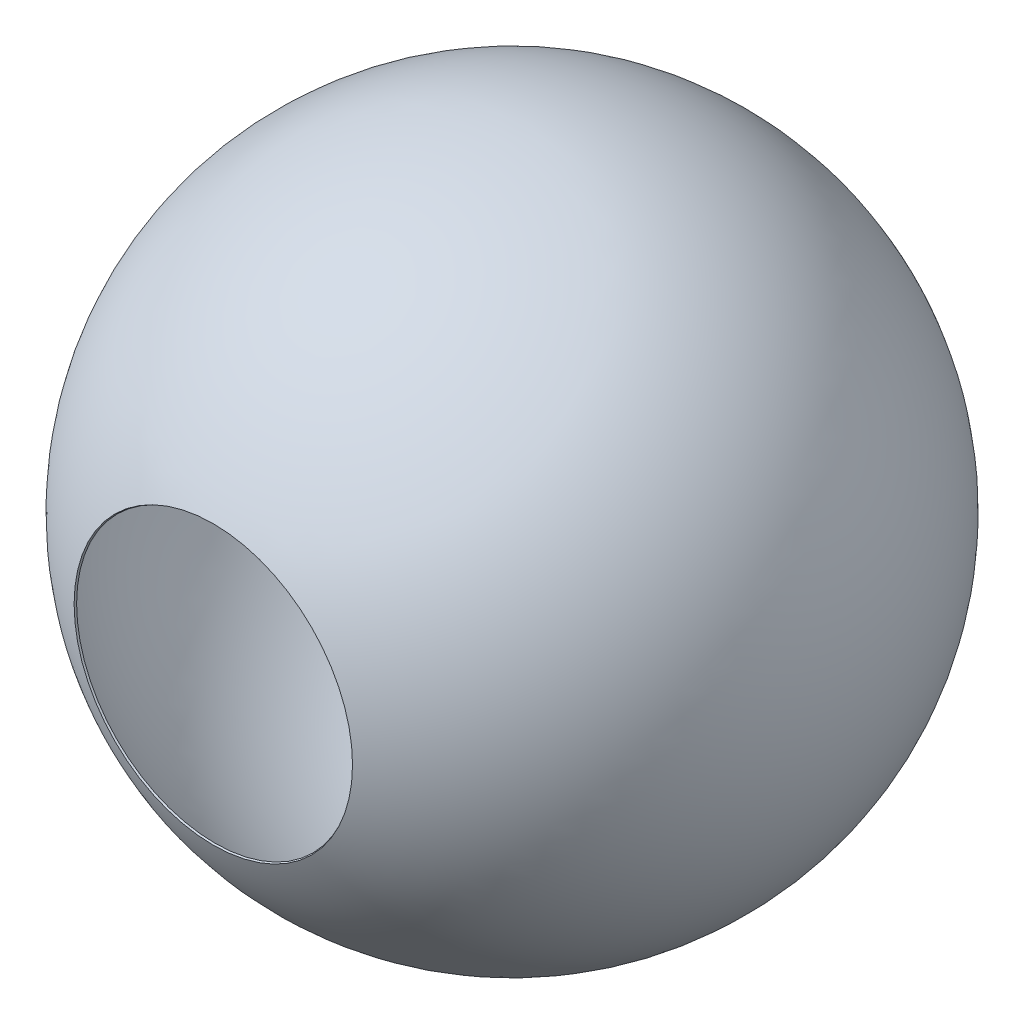
ISO-10303-21;
HEADER;
FILE_DESCRIPTION(('STEP AP214'),'2;1');
FILE_NAME('part.step','',(''),(''),'','','');
FILE_SCHEMA(('AUTOMOTIVE_DESIGN { 1 0 10303 214 1 1 1 1 }'));
ENDSEC;
DATA;
#1=APPLICATION_CONTEXT('core data for automotive mechanical design processes');
#2=APPLICATION_PROTOCOL_DEFINITION('international standard','automotive_design',2000,#1);
#3=PRODUCT_CONTEXT('',#1,'mechanical');
#4=PRODUCT('Part','Part','',(#3));
#5=PRODUCT_RELATED_PRODUCT_CATEGORY('part','',(#4));
#6=PRODUCT_DEFINITION_FORMATION('','',#4);
#7=PRODUCT_DEFINITION_CONTEXT('part definition',#1,'design');
#8=PRODUCT_DEFINITION('design','',#6,#7);
#9=PRODUCT_DEFINITION_SHAPE('','',#8);
#10=(LENGTH_UNIT() NAMED_UNIT(*) SI_UNIT(.MILLI.,.METRE.));
#11=(NAMED_UNIT(*) PLANE_ANGLE_UNIT() SI_UNIT($,.RADIAN.));
#12=(NAMED_UNIT(*) SI_UNIT($,.STERADIAN.) SOLID_ANGLE_UNIT());
#13=UNCERTAINTY_MEASURE_WITH_UNIT(LENGTH_MEASURE(1.E-05),#10,'distance_accuracy_value','');
#14=(GEOMETRIC_REPRESENTATION_CONTEXT(3) GLOBAL_UNCERTAINTY_ASSIGNED_CONTEXT((#13)) GLOBAL_UNIT_ASSIGNED_CONTEXT((#10,
#11,#12)) REPRESENTATION_CONTEXT('',''));
#15=CARTESIAN_POINT('',(0.,0.,0.));
#16=DIRECTION('',(0.,0.,1.));
#17=DIRECTION('',(1.,0.,0.));
#18=AXIS2_PLACEMENT_3D('',#15,#16,#17);
#19=CARTESIAN_POINT('',(0.,125.,-531.601551916471));
#20=DIRECTION('',(0.,0.,1.));
#21=DIRECTION('',(0.,-1.,0.));
#22=AXIS2_PLACEMENT_3D('',#19,#20,#21);
#23=PLANE('',#22);
#24=CARTESIAN_POINT('',(0.,2.4980018054066E-13,-531.601551916471));
#25=DIRECTION('',(0.,0.,1.));
#26=DIRECTION('',(0.,-1.,0.));
#27=AXIS2_PLACEMENT_3D('',#24,#25,#26);
#28=CIRCLE('',#27,125.);
#29=CARTESIAN_POINT('',(0.,125.,-531.601551916471));
#30=VERTEX_POINT('',#29);
#31=EDGE_CURVE('E10',#30,#30,#28,.T.);
#32=ORIENTED_EDGE('',*,*,#31,.F.);
#33=EDGE_LOOP('',(#32));
#34=FACE_BOUND('',#33,.T.);
#35=ADVANCED_FACE('F36',(#34),#23,.F.);
#36=CARTESIAN_POINT('',(0.,0.,0.));
#37=DIRECTION('',(0.,0.,1.));
#38=DIRECTION('',(0.,1.,0.));
#39=AXIS2_PLACEMENT_3D('',#36,#37,#38);
#40=SPHERICAL_SURFACE('',#39,546.1);
#41=CARTESIAN_POINT('',(0.,0.,495.));
#42=DIRECTION('',(0.,0.,1.));
#43=DIRECTION('',(0.,-1.,0.));
#44=AXIS2_PLACEMENT_3D('',#41,#42,#43);
#45=CIRCLE('',#44,230.651707125701);
#46=CARTESIAN_POINT('',(0.,230.6517071257,495.));
#47=VERTEX_POINT('',#46);
#48=EDGE_CURVE('E42',#47,#47,#45,.T.);
#49=CARTESIAN_POINT('',(0.,230.6517071257,495.));
#50=CARTESIAN_POINT('',(0.,233.841623475158,493.513621901903));
#51=CARTESIAN_POINT('',(0.,237.017167923415,491.996400730098));
#52=CARTESIAN_POINT('',(0.,243.338334990175,488.900857304928));
#53=CARTESIAN_POINT('',(0.,246.483957608678,487.322535051562));
#54=CARTESIAN_POINT('',(0.,252.744102988575,484.105374529126));
#55=CARTESIAN_POINT('',(0.,255.85862574997,482.466536260054));
#56=CARTESIAN_POINT('',(0.,262.055408008267,479.128957508647));
#57=CARTESIAN_POINT('',(0.,265.13766750517,477.430217026311));
#58=CARTESIAN_POINT('',(0.,271.268771082452,473.973468399462));
#59=CARTESIAN_POINT('',(0.,274.317615162832,472.215460254949));
#60=CARTESIAN_POINT('',(0.,280.380748459058,468.640833445209));
#61=CARTESIAN_POINT('',(0.,283.395037674904,466.824214779983));
#62=CARTESIAN_POINT('',(0.,289.387934651151,463.133045858016));
#63=CARTESIAN_POINT('',(0.,292.366542411552,461.258495601275));
#64=CARTESIAN_POINT('',(0.,298.286963237245,457.452164108726));
#65=CARTESIAN_POINT('',(0.,301.228776302538,455.520382872918));
#66=CARTESIAN_POINT('',(0.,307.074508246087,451.600311416081));
#67=CARTESIAN_POINT('',(0.,309.978427124342,449.612021195052));
#68=CARTESIAN_POINT('',(0.,315.747285365801,445.579674883896));
#69=CARTESIAN_POINT('',(0.,318.612224729004,443.535618793769));
#70=CARTESIAN_POINT('',(0.,324.302053180482,439.392504702207));
#71=CARTESIAN_POINT('',(0.,327.126942268758,437.293446700772));
#72=CARTESIAN_POINT('',(0.,332.735614379223,433.041113301295));
#73=CARTESIAN_POINT('',(0.,335.519397401411,430.887837903252));
#74=CARTESIAN_POINT('',(0.,341.044816951747,426.527874488755));
#75=CARTESIAN_POINT('',(0.,343.786453479896,424.321186472301));
#76=CARTESIAN_POINT('',(0.,349.226555366293,419.855222561943));
#77=CARTESIAN_POINT('',(0.,351.925020724542,417.59594666804));
#78=CARTESIAN_POINT('',(0.,357.277771730332,413.025651398257));
#79=CARTESIAN_POINT('',(0.,359.932057377874,410.714632022377));
#80=CARTESIAN_POINT('',(0.,365.195456933438,406.041713523036));
#81=CARTESIAN_POINT('',(0.,367.804570841461,403.679814399574));
#82=CARTESIAN_POINT('',(0.,372.976651771931,398.906019155572));
#83=CARTESIAN_POINT('',(0.,375.539618794379,396.494123035031));
#84=CARTESIAN_POINT('',(0.,380.618448054866,391.621235233549));
#85=CARTESIAN_POINT('',(0.,383.134310292904,389.16024355261));
#86=CARTESIAN_POINT('',(0.,388.117989690961,384.190084416286));
#87=CARTESIAN_POINT('',(0.,390.585806850979,381.680916960902));
#88=CARTESIAN_POINT('',(0.,395.472473756047,376.615344067151));
#89=CARTESIAN_POINT('',(0.,397.891323501096,374.058938628783));
#90=CARTESIAN_POINT('',(0.,402.679151540654,368.899845215534));
#91=CARTESIAN_POINT('',(0.,405.048129835162,366.297157240653));
#92=CARTESIAN_POINT('',(0.,409.735329577324,361.046471498764));
#93=CARTESIAN_POINT('',(0.,412.053551024977,358.398473731756));
#94=CARTESIAN_POINT('',(0.,416.638370647289,353.058158084356));
#95=CARTESIAN_POINT('',(0.,418.904968821947,350.365840203964));
#96=CARTESIAN_POINT('',(0.,423.38569476612,344.937890573007));
#97=CARTESIAN_POINT('',(0.,425.599822535635,342.202258822442));
#98=CARTESIAN_POINT('',(0.,429.974780147985,336.688703882737));
#99=CARTESIAN_POINT('',(0.,432.135609990819,333.910780693598));
#100=CARTESIAN_POINT('',(0.,436.403164148158,328.313681114604));
#101=CARTESIAN_POINT('',(0.,438.509888462662,325.494504724748));
#102=CARTESIAN_POINT('',(0.,442.66844418342,319.815952400401));
#103=CARTESIAN_POINT('',(0.,444.720275589674,316.95657646591));
#104=CARTESIAN_POINT('',(0.,448.768278630019,311.19869373279));
#105=CARTESIAN_POINT('',(0.,450.764450264111,308.300186934163));
#106=CARTESIAN_POINT('',(0.,454.70038769884,302.46512577828));
#107=CARTESIAN_POINT('',(0.,456.640153499477,299.528571421024));
#108=CARTESIAN_POINT('',(0.,460.462554287466,293.618512673517));
#109=CARTESIAN_POINT('',(0.,462.345189274817,290.645008283266));
#110=CARTESIAN_POINT('',(0.,466.052624808815,284.66216080533));
#111=CARTESIAN_POINT('',(0.,467.877425355463,281.652817717646));
#112=CARTESIAN_POINT('',(0.,471.468509996033,275.599417574977));
#113=CARTESIAN_POINT('',(0.,473.234794089955,272.555360519993));
#114=CARTESIAN_POINT('',(0.,476.708185683347,266.433670147069));
#115=CARTESIAN_POINT('',(0.,478.415293182816,263.356036829129));
#116=CARTESIAN_POINT('',(0.,481.769693562593,257.168344183631));
#117=CARTESIAN_POINT('',(0.,483.416986442901,254.058284856073));
#118=CARTESIAN_POINT('',(0.,486.651141915124,247.806902563773));
#119=CARTESIAN_POINT('',(0.,488.23800450704,244.66557959903));
#120=CARTESIAN_POINT('',(0.,491.350706318831,238.352844089454));
#121=CARTESIAN_POINT('',(0.,492.876545538707,235.18143154462));
#122=CARTESIAN_POINT('',(0.,495.866630330016,228.809702177817));
#123=CARTESIAN_POINT('',(0.,497.330875901449,225.609385355848));
#124=CARTESIAN_POINT('',(0.,500.197226139854,219.18104354059));
#125=CARTESIAN_POINT('',(0.,501.599330806825,215.953018547301));
#126=CARTESIAN_POINT('',(0.,504.340875205206,209.47046685104));
#127=CARTESIAN_POINT('',(0.,505.680314936615,206.215940148067));
#128=CARTESIAN_POINT('',(0.,508.296028853545,199.681601398983));
#129=CARTESIAN_POINT('',(0.,509.572303039064,196.401789352872));
#130=CARTESIAN_POINT('',(0.,512.061208861761,189.818105734353));
#131=CARTESIAN_POINT('',(0.,513.273840498937,186.514234161946));
#132=CARTESIAN_POINT('',(0.,515.635008008646,179.883666299833));
#133=CARTESIAN_POINT('',(0.,516.783543881178,176.556970010126));
#134=CARTESIAN_POINT('',(0.,519.016090600836,169.881996053058));
#135=CARTESIAN_POINT('',(0.,520.100101447961,166.533718385696));
#136=CARTESIAN_POINT('',(0.,522.203192972019,159.816833078916));
#137=CARTESIAN_POINT('',(0.,523.222273648951,156.448225439498));
#138=CARTESIAN_POINT('',(0.,525.195123955229,149.691939192453));
#139=CARTESIAN_POINT('',(0.,526.148893584576,146.304260584825));
#140=CARTESIAN_POINT('',(0.,527.990765328038,139.511098532906));
#141=CARTESIAN_POINT('',(0.,528.878867442154,136.105615088615));
#142=CARTESIAN_POINT('',(0.,530.589072230486,129.278116149401));
#143=CARTESIAN_POINT('',(0.,531.411174904702,125.856100654479));
#144=CARTESIAN_POINT('',(0.,532.989073555595,118.996816578826));
#145=CARTESIAN_POINT('',(0.,533.744869532272,115.559547998095));
#146=CARTESIAN_POINT('',(0.,535.189872312316,108.671042416428));
#147=CARTESIAN_POINT('',(0.,535.879079115683,105.219805415491));
#148=CARTESIAN_POINT('',(0.,537.190645960776,98.3046528796574));
#149=CARTESIAN_POINT('',(0.,537.813006002503,94.8407373447602));
#150=CARTESIAN_POINT('',(0.,538.9906467197,87.9015223658021));
#151=CARTESIAN_POINT('',(0.,539.54592739517,84.4262229217412));
#152=CARTESIAN_POINT('',(0.,540.589201845888,77.4655390039443));
#153=CARTESIAN_POINT('',(0.,541.077195621135,73.9801545302082));
#154=CARTESIAN_POINT('',(0.,541.985713885654,67.0006032017894));
#155=CARTESIAN_POINT('',(0.,542.406238374926,63.5064363471067));
#156=CARTESIAN_POINT('',(0.,543.17966089812,56.5106261879034));
#157=CARTESIAN_POINT('',(0.,543.532558932043,53.0089828833828));
#158=CARTESIAN_POINT('',(0.,544.17059665029,45.9995285499063));
#159=CARTESIAN_POINT('',(0.,544.455736334613,42.4917175209504));
#160=CARTESIAN_POINT('',(0.,544.958150783825,35.4712387691686));
#161=CARTESIAN_POINT('',(0.,545.175425548714,31.9585710463427));
#162=CARTESIAN_POINT('',(0.,545.54202895347,24.9296917525564));
#163=CARTESIAN_POINT('',(0.,545.691357593336,21.4134801815959));
#164=CARTESIAN_POINT('',(0.,545.922012937055,14.3788273617753));
#165=CARTESIAN_POINT('',(0.,546.003339640907,10.860386112915));
#166=CARTESIAN_POINT('',(0.,546.097960717063,3.82258894086293));
#167=CARTESIAN_POINT('',(0.,546.111255089366,0.303233017671086));
#168=CARTESIAN_POINT('',(0.,546.069806533704,-6.73507815762023));
#169=CARTESIAN_POINT('',(0.,546.015063605738,-10.2540334097197));
#170=CARTESIAN_POINT('',(0.,545.837560909492,-17.2902280471514));
#171=CARTESIAN_POINT('',(0.,545.714801141211,-20.8074674324836));
#172=CARTESIAN_POINT('',(0.,545.401310645316,-27.8389157820045));
#173=CARTESIAN_POINT('',(0.,545.210579917701,-31.3531247461931));
#174=CARTESIAN_POINT('',(0.,544.761218787994,-38.3771988316585));
#175=CARTESIAN_POINT('',(0.,544.502588385903,-41.8870639529353));
#176=CARTESIAN_POINT('',(0.,543.91752456934,-48.9011385543025));
#177=CARTESIAN_POINT('',(0.,543.591091154868,-52.4053480343931));
#178=CARTESIAN_POINT('',(0.,542.870543316746,-59.4068016688875));
#179=CARTESIAN_POINT('',(0.,542.476428893097,-62.9040458232913));
#180=CARTESIAN_POINT('',(0.,541.620666335335,-69.8902617251749));
#181=CARTESIAN_POINT('',(0.,541.159018201223,-73.3792334726545));
#182=CARTESIAN_POINT('',(0.,540.168360761709,-80.3476005712317));
#183=CARTESIAN_POINT('',(0.,539.639351456307,-83.8269959223292));
#184=CARTESIAN_POINT('',(0.,538.514169389359,-90.7749098178244));
#185=CARTESIAN_POINT('',(0.,537.917996627814,-94.2434283622222));
#186=CARTESIAN_POINT('',(0.,536.658710465801,-101.168292299164));
#187=CARTESIAN_POINT('',(0.,535.995597065335,-104.624637691709));
#188=CARTESIAN_POINT('',(0.,534.602677461504,-111.523863529457));
#189=CARTESIAN_POINT('',(0.,533.87287125814,-114.966743974662));
#190=CARTESIAN_POINT('',(0.,532.34683881071,-121.837753154716));
#191=CARTESIAN_POINT('',(0.,531.550612566645,-125.265881889566));
#192=CARTESIAN_POINT('',(0.,529.892037624237,-132.106106399289));
#193=CARTESIAN_POINT('',(0.,529.029688925895,-135.518202174162));
#194=CARTESIAN_POINT('',(0.,527.239191374365,-142.325085506566));
#195=CARTESIAN_POINT('',(0.,526.311042521178,-145.719873064097));
#196=CARTESIAN_POINT('',(0.,524.389291551939,-152.49087117333));
#197=CARTESIAN_POINT('',(0.,523.395689435888,-155.867081725031));
#198=CARTESIAN_POINT('',(0.,521.343403295801,-162.599663977199));
#199=CARTESIAN_POINT('',(0.,520.284719271765,-165.956035677665));
#200=CARTESIAN_POINT('',(0.,518.102664994697,-172.647685796651));
#201=CARTESIAN_POINT('',(0.,516.979294741664,-175.98296421517));
#202=CARTESIAN_POINT('',(0.,514.668287861811,-182.631181223081));
#203=CARTESIAN_POINT('',(0.,513.480651234991,-185.944119812472));
#204=CARTESIAN_POINT('',(0.,511.04155548208,-192.546418964368));
#205=CARTESIAN_POINT('',(0.,509.790096355988,-195.835779526873));
#206=CARTESIAN_POINT('',(0.,507.223823332455,-202.389693239433));
#207=CARTESIAN_POINT('',(0.,505.909009435014,-205.654246389489));
#208=CARTESIAN_POINT('',(0.,503.216518275302,-212.157325163259));
#209=CARTESIAN_POINT('',(0.,501.83884101303,-215.395850786974));
#210=CARTESIAN_POINT('',(0.,499.021138025111,-221.84566412186));
#211=CARTESIAN_POINT('',(0.,497.581112299463,-225.05695183303));
#212=CARTESIAN_POINT('',(0.,494.639250588738,-231.451089136683));
#213=CARTESIAN_POINT('',(0.,493.137414603662,-234.633938729166));
#214=CARTESIAN_POINT('',(0.,490.072493679367,-240.970010217937));
#215=CARTESIAN_POINT('',(0.,488.509408740149,-244.123232114226));
#216=CARTESIAN_POINT('',(0.,485.322574104416,-250.398869706334));
#217=CARTESIAN_POINT('',(0.,483.6988244079,-253.521285402155));
#218=CARTESIAN_POINT('',(0.,480.391267127631,-259.734143602752));
#219=CARTESIAN_POINT('',(0.,478.707459543876,-262.824586107529));
#220=CARTESIAN_POINT('',(0.,475.280415805584,-268.972342885317));
#221=CARTESIAN_POINT('',(0.,473.537179651048,-272.029657158328));
#222=CARTESIAN_POINT('',(0.,469.991930298843,-278.110014813407));
#223=CARTESIAN_POINT('',(0.,468.189917101174,-281.133058195476));
#224=CARTESIAN_POINT('',(0.,464.527787158047,-287.143744218107));
#225=CARTESIAN_POINT('',(0.,462.667670412588,-290.131386858669));
#226=CARTESIAN_POINT('',(0.,458.890028585191,-296.070154778608));
#227=CARTESIAN_POINT('',(0.,456.972503503252,-299.021280057985));
#228=CARTESIAN_POINT('',(0.,453.080761670349,-304.885910284097));
#229=CARTESIAN_POINT('',(0.,451.106544919384,-307.799415230832));
#230=CARTESIAN_POINT('',(0.,447.102157604166,-313.587715880653));
#231=CARTESIAN_POINT('',(0.,445.071987039914,-316.462511583739));
#232=CARTESIAN_POINT('',(0.,440.95645086638,-322.172319302685));
#233=CARTESIAN_POINT('',(0.,438.871085257099,-325.007331318544));
#234=CARTESIAN_POINT('',(0.,434.645938390695,-330.636512088454));
#235=CARTESIAN_POINT('',(0.,432.506157133573,-333.430680842503));
#236=CARTESIAN_POINT('',(0.,428.172978706309,-338.977130779219));
#237=CARTESIAN_POINT('',(0.,425.979581536169,-341.729411961886));
#238=CARTESIAN_POINT('',(0.,421.539991056428,-347.191058101576));
#239=CARTESIAN_POINT('',(0.,419.293797746828,-349.9004230586));
#240=CARTESIAN_POINT('',(0.,414.749454494078,-355.275224132517));
#241=CARTESIAN_POINT('',(0.,412.451304550928,-357.94066024941));
#242=CARTESIAN_POINT('',(0.,407.803906955571,-363.226607446808));
#243=CARTESIAN_POINT('',(0.,405.454659303366,-365.847118527312));
#244=CARTESIAN_POINT('',(0.,400.705944311963,-371.042236246231));
#245=CARTESIAN_POINT('',(0.,398.306476972766,-373.616842884645));
#246=CARTESIAN_POINT('',(0.,393.458219398853,-378.719189470285));
#247=CARTESIAN_POINT('',(0.,391.009429164137,-381.246929417512));
#248=CARTESIAN_POINT('',(0.,386.063441024901,-386.25459788792));
#249=CARTESIAN_POINT('',(0.,383.566243120379,-388.734526411103));
#250=CARTESIAN_POINT('',(0.,378.524372959417,-393.645645169899));
#251=CARTESIAN_POINT('',(0.,375.979700702977,-396.076835405513));
#252=CARTESIAN_POINT('',(0.,370.843832899418,-400.889568941391));
#253=CARTESIAN_POINT('',(0.,368.2526373523,-403.271112241655));
#254=CARTESIAN_POINT('',(0.,363.024691416521,-407.983661814399));
#255=CARTESIAN_POINT('',(0.,360.38794102786,-410.314668086879));
#256=CARTESIAN_POINT('',(0.,355.069870884077,-414.925272399634));
#257=CARTESIAN_POINT('',(0.,352.388551128954,-417.20487043991));
#258=CARTESIAN_POINT('',(0.,346.982344384951,-421.711806297463));
#259=CARTESIAN_POINT('',(0.,344.257457396071,-423.93914411474));
#260=CARTESIAN_POINT('',(0.,338.76513460034,-428.340727067552));
#261=CARTESIAN_POINT('',(0.,335.997698793489,-430.514972203088));
#262=CARTESIAN_POINT('',(0.,330.421312680057,-434.809557176856));
#263=CARTESIAN_POINT('',(0.,327.612362373476,-436.929897015089));
#264=CARTESIAN_POINT('',(0.,321.953997094704,-441.115878925583));
#265=CARTESIAN_POINT('',(0.,319.104582122513,-443.181520997844));
#266=CARTESIAN_POINT('',(0.,313.366352470152,-447.2573353508));
#267=CARTESIAN_POINT('',(0.,310.477537789982,-449.267507631496));
#268=CARTESIAN_POINT('',(0.,304.66158840478,-453.231631107343));
#269=CARTESIAN_POINT('',(0.,301.734453699747,-455.185582302494));
#270=CARTESIAN_POINT('',(0.,295.842958269894,-459.036533325686));
#271=CARTESIAN_POINT('',(0.,292.878597545074,-460.933533153725));
#272=CARTESIAN_POINT('',(0.,286.913757993798,-464.669872446474));
#273=CARTESIAN_POINT('',(0.,283.913279167343,-466.509211911182));
#274=CARTESIAN_POINT('',(0.,277.877324829949,-470.129543031383));
#275=CARTESIAN_POINT('',(0.,274.841849319011,-471.910534686875));
#276=CARTESIAN_POINT('',(0.,268.737036109675,-475.413504550021));
#277=CARTESIAN_POINT('',(0.,265.667698411277,-477.135482757676));
#278=CARTESIAN_POINT('',(0.,259.496307979907,-480.51978214257));
#279=CARTESIAN_POINT('',(0.,256.394255246935,-482.182103319809));
#280=CARTESIAN_POINT('',(0.,250.158594126414,-485.446467357877));
#281=CARTESIAN_POINT('',(0.,247.024985738866,-487.048510218704));
#282=CARTESIAN_POINT('',(0.,240.727384482995,-490.191718866732));
#283=CARTESIAN_POINT('',(0.,237.563391614671,-491.732884653933));
#284=CARTESIAN_POINT('',(0.,231.206203927132,-494.753763150068));
#285=CARTESIAN_POINT('',(0.,228.013009107917,-496.233475859003));
#286=CARTESIAN_POINT('',(0.,221.59861096258,-499.130895161772));
#287=CARTESIAN_POINT('',(0.,218.377407636459,-500.548601755604));
#288=CARTESIAN_POINT('',(0.,211.908196389409,-503.321478966047));
#289=CARTESIAN_POINT('',(0.,208.660188468481,-504.676649582656));
#290=CARTESIAN_POINT('',(0.,202.138581961864,-507.32394834845));
#291=CARTESIAN_POINT('',(0.,198.864983376174,-508.616076497636));
#292=CARTESIAN_POINT('',(0.,192.293419035111,-511.1368074027));
#293=CARTESIAN_POINT('',(0.,188.995453279738,-512.365410158578));
#294=CARTESIAN_POINT('',(0.,182.376387199191,-514.758631084393));
#295=CARTESIAN_POINT('',(0.,179.055286874017,-515.92324925433));
#296=CARTESIAN_POINT('',(0.,172.391192908903,-518.18806576364));
#297=CARTESIAN_POINT('',(0.,169.048199268963,-519.288264103013));
#298=CARTESIAN_POINT('',(0.,162.341568079429,-521.423829656245));
#299=CARTESIAN_POINT('',(0.,158.977930529834,-522.459196870103));
#300=CARTESIAN_POINT('',(0.,152.231268762838,-524.464713581661));
#301=CARTESIAN_POINT('',(0.,148.848244545435,-525.434863079361));
#302=CARTESIAN_POINT('',(0.,142.064073478206,-527.309580374088));
#303=CARTESIAN_POINT('',(0.,138.662926628379,-528.214148171115));
#304=CARTESIAN_POINT('',(0.,131.843782792405,-529.957369191897));
#305=CARTESIAN_POINT('',(0.,128.425785806257,-530.796022415652));
#306=CARTESIAN_POINT('',(0.,125.,-531.601551916471));
#307=B_SPLINE_CURVE_WITH_KNOTS('',3,(#49,#50,#51,#52,#53,#54,#55,#56,#57,#58,#59,#60,#61,#62,
#63,#64,#65,#66,#67,#68,#69,#70,#71,#72,#73,#74,#75,#76,#77,#78,#79,#80,#81,#82,#83,#84,#85,#86,
#87,#88,#89,#90,#91,#92,#93,#94,#95,#96,#97,#98,#99,#100,#101,#102,#103,#104,#105,#106,#107,
#108,#109,#110,#111,#112,#113,#114,#115,#116,#117,#118,#119,#120,#121,#122,#123,#124,#125,#126,
#127,#128,#129,#130,#131,#132,#133,#134,#135,#136,#137,#138,#139,#140,#141,#142,#143,#144,#145,
#146,#147,#148,#149,#150,#151,#152,#153,#154,#155,#156,#157,#158,#159,#160,#161,#162,#163,#164,
#165,#166,#167,#168,#169,#170,#171,#172,#173,#174,#175,#176,#177,#178,#179,#180,#181,#182,#183,
#184,#185,#186,#187,#188,#189,#190,#191,#192,#193,#194,#195,#196,#197,#198,#199,#200,#201,#202,
#203,#204,#205,#206,#207,#208,#209,#210,#211,#212,#213,#214,#215,#216,#217,#218,#219,#220,#221,
#222,#223,#224,#225,#226,#227,#228,#229,#230,#231,#232,#233,#234,#235,#236,#237,#238,#239,#240,
#241,#242,#243,#244,#245,#246,#247,#248,#249,#250,#251,#252,#253,#254,#255,#256,#257,#258,#259,
#260,#261,#262,#263,#264,#265,#266,#267,#268,#269,#270,#271,#272,#273,#274,#275,#276,#277,#278,
#279,#280,#281,#282,#283,#284,#285,#286,#287,#288,#289,#290,#291,#292,#293,#294,#295,#296,#297,
#298,#299,#300,#301,#302,#303,#304,#305,#306),.UNSPECIFIED.,.F.,.F.,(4,2,2,2,2,2,2,2,2,2,2,2,2,
2,2,2,2,2,2,2,2,2,2,2,2,2,2,2,2,2,2,2,2,2,2,2,2,2,2,2,2,2,2,2,2,2,2,2,2,2,2,2,2,2,2,2,2,2,2,2,2,
2,2,2,2,2,2,2,2,2,2,2,2,2,2,2,2,2,2,2,2,2,2,2,2,2,2,2,2,2,2,2,2,2,2,2,2,2,2,2,2,2,2,2,2,2,2,2,2,
2,2,2,2,2,2,2,2,2,2,2,2,2,2,2,2,2,2,2,4),(0.,10.5574854211696,21.1149708423392,31.6724562635088,
42.2299416846784,52.7874271058481,63.3449125270177,73.9023979481873,84.4598833693569,
95.0173687905265,105.574854211696,116.132339632866,126.689825054035,137.247310475205,
147.804795896375,158.362281317544,168.919766738714,179.477252159883,190.034737581053,
200.592223002223,211.149708423392,221.707193844562,232.264679265732,242.822164686901,
253.379650108071,263.93713552924,274.49462095041,285.052106371579,295.609591792749,
306.167077213919,316.724562635088,327.282048056258,337.839533477428,348.397018898597,
358.954504319767,369.511989740936,380.069475162106,390.626960583276,401.184446004445,
411.741931425615,422.299416846785,432.856902267954,443.414387689124,453.971873110294,
464.529358531463,475.086843952633,485.644329373802,496.201814794972,506.759300216141,
517.316785637311,527.874271058481,538.43175647965,548.98924190082,559.54672732199,
570.104212743159,580.661698164329,591.219183585498,601.776669006668,612.334154427838,
622.891639849007,633.449125270177,644.006610691347,654.564096112516,665.121581533686,
675.679066954855,686.236552376025,696.794037797195,707.351523218364,717.909008639534,
728.466494060703,739.023979481873,749.581464903043,760.138950324212,770.696435745382,
781.253921166552,791.811406587721,802.368892008891,812.92637743006,823.48386285123,
834.041348272399,844.598833693569,855.156319114739,865.713804535908,876.271289957078,
886.828775378248,897.386260799417,907.943746220587,918.501231641756,929.058717062926,
939.616202484096,950.173687905265,960.731173326435,971.288658747605,981.846144168774,
992.403629589944,1002.96111501111,1013.51860043228,1024.07608585345,1034.63357127462,
1045.19105669579,1055.74854211696,1066.30602753813,1076.8635129593,1087.42099838047,
1097.97848380164,1108.53596922281,1119.09345464398,1129.65094006515,1140.20842548632,
1150.76591090749,1161.32339632866,1171.88088174983,1182.438367171,1192.99585259217,
1203.55333801334,1214.11082343451,1224.66830885568,1235.22579427685,1245.78327969802,
1256.34076511919,1266.89825054036,1277.45573596152,1288.01322138269,1298.57070680386,
1309.12819222503,1319.6856776462,1330.24316306737,1340.80064848854,1351.35813390971),.UNSPECIFIED.);
#308=EDGE_CURVE('BSEAM66',#47,#30,#307,.T.);
#309=ORIENTED_EDGE('',*,*,#48,.F.);
#310=ORIENTED_EDGE('',*,*,#31,.T.);
#311=ORIENTED_EDGE('',*,*,#308,.T.);
#312=ORIENTED_EDGE('',*,*,#308,.F.);
#313=EDGE_LOOP('',(#309,#311,#310,#312));
#314=FACE_BOUND('',#313,.T.);
#315=ADVANCED_FACE('F66',(#314),#40,.T.);
#316=CARTESIAN_POINT('',(0.,0.,495.));
#317=DIRECTION('',(0.,0.,1.));
#318=DIRECTION('',(0.,-1.,0.));
#319=AXIS2_PLACEMENT_3D('',#316,#317,#318);
#320=CONICAL_SURFACE('',#319,230.651707125701,0.436049212280005);
#321=CARTESIAN_POINT('',(0.,0.,492.190075077824));
#322=DIRECTION('',(0.,0.,1.));
#323=DIRECTION('',(0.,-1.,0.));
#324=AXIS2_PLACEMENT_3D('',#321,#322,#323);
#325=CIRCLE('',#324,229.34238595359);
#326=CARTESIAN_POINT('',(0.,229.34238595359,492.190075077825));
#327=VERTEX_POINT('',#326);
#328=EDGE_CURVE('E46',#327,#327,#325,.T.);
#329=ORIENTED_EDGE('',*,*,#328,.F.);
#330=EDGE_LOOP('',(#329));
#331=FACE_BOUND('',#330,.T.);
#332=ORIENTED_EDGE('',*,*,#48,.T.);
#333=EDGE_LOOP('',(#332));
#334=FACE_BOUND('',#333,.T.);
#335=ADVANCED_FACE('F61',(#331,#334),#320,.F.);
#336=CARTESIAN_POINT('',(0.,0.,0.));
#337=DIRECTION('',(0.,0.,1.));
#338=DIRECTION('',(0.,1.,0.));
#339=AXIS2_PLACEMENT_3D('',#336,#337,#338);
#340=SPHERICAL_SURFACE('',#339,543.);
#341=CARTESIAN_POINT('',(0.,2.49035389328567E-13,-528.50155191647));
#342=DIRECTION('',(0.,0.,1.));
#343=DIRECTION('',(0.,-1.,0.));
#344=AXIS2_PLACEMENT_3D('',#341,#342,#343);
#345=CIRCLE('',#344,124.63991985669);
#346=CARTESIAN_POINT('',(0.,124.63991985669,-528.50155191647));
#347=VERTEX_POINT('',#346);
#348=EDGE_CURVE('E50',#347,#347,#345,.T.);
#349=CARTESIAN_POINT('',(0.,124.63991985669,-528.50155191647));
#350=CARTESIAN_POINT('',(0.,128.044818339712,-527.698557468621));
#351=CARTESIAN_POINT('',(0.,131.441954591079,-526.862650058009));
#352=CARTESIAN_POINT('',(0.,138.219438588637,-525.125340856513));
#353=CARTESIAN_POINT('',(0.,141.599786334829,-524.223939065629));
#354=CARTESIAN_POINT('',(0.,148.342429280172,-522.35597264884));
#355=CARTESIAN_POINT('',(0.,151.704724479323,-521.389408022935));
#356=CARTESIAN_POINT('',(0.,158.410006712572,-519.391478378126));
#357=CARTESIAN_POINT('',(0.,161.752993746668,-518.360113359221));
#358=CARTESIAN_POINT('',(0.,168.418410794026,-516.23296781986));
#359=CARTESIAN_POINT('',(0.,171.740840807288,-515.137187299404));
#360=CARTESIAN_POINT('',(0.,178.363902756846,-512.881620181223));
#361=CARTESIAN_POINT('',(0.,181.664534693142,-511.721833583499));
#362=CARTESIAN_POINT('',(0.,188.242767542899,-509.33868751819));
#363=CARTESIAN_POINT('',(0.,191.520368456361,-508.115328050606));
#364=CARTESIAN_POINT('',(0.,198.0513149264,-505.60549323419));
#365=CARTESIAN_POINT('',(0.,201.304660482978,-504.319017885359));
#366=CARTESIAN_POINT('',(0.,207.785880963377,-501.683431862716));
#367=CARTESIAN_POINT('',(0.,211.013755887199,-500.334321188904));
#368=CARTESIAN_POINT('',(0.,217.4428293413,-497.573968472191));
#369=CARTESIAN_POINT('',(0.,220.644027871579,-496.16272642929));
#370=CARTESIAN_POINT('',(0.,227.018552742511,-493.278638138583));
#371=CARTESIAN_POINT('',(0.,230.191879083163,-491.805791890777));
#372=CARTESIAN_POINT('',(0.,236.509474190355,-488.799045366651));
#373=CARTESIAN_POINT('',(0.,239.653742956895,-487.265145090329));
#374=CARTESIAN_POINT('',(0.,245.912048385718,-484.13686349202));
#375=CARTESIAN_POINT('',(0.,249.026085048,-482.542482170032));
#376=CARTESIAN_POINT('',(0.,255.222763031258,-479.293834055728));
#377=CARTESIAN_POINT('',(0.,258.305404352232,-477.639567263412));
#378=CARTESIAN_POINT('',(0.,264.438140143438,-474.271766153783));
#379=CARTESIAN_POINT('',(0.,267.48823461367,-472.558231836471));
#380=CARTESIAN_POINT('',(0.,273.554737351711,-469.072535761353));
#381=CARTESIAN_POINT('',(0.,276.571145619521,-467.300374003547));
#382=CARTESIAN_POINT('',(0.,282.5691491844,-463.698085032011));
#383=CARTESIAN_POINT('',(0.,285.550744481469,-461.86795781828));
#384=CARTESIAN_POINT('',(0.,291.478008340805,-458.150421572247));
#385=CARTESIAN_POINT('',(0.,294.423676903071,-456.263012539944));
#386=CARTESIAN_POINT('',(0.,300.277986949042,-452.431617691537));
#387=CARTESIAN_POINT('',(0.,303.186628432745,-450.487631875431));
#388=CARTESIAN_POINT('',(0.,308.96579780916,-446.543809628237));
#389=CARTESIAN_POINT('',(0.,311.836325701871,-444.543973197148));
#390=CARTESIAN_POINT('',(0.,317.538195621063,-440.4891967516));
#391=CARTESIAN_POINT('',(0.,320.369537647544,-438.434256737141));
#392=CARTESIAN_POINT('',(0.,325.991978196776,-434.270040740209));
#393=CARTESIAN_POINT('',(0.,328.783076719527,-432.160764757736));
#394=CARTESIAN_POINT('',(0.,334.323987656615,-427.888664737136));
#395=CARTESIAN_POINT('',(0.,337.073800070952,-425.725840699008));
#396=CARTESIAN_POINT('',(0.,342.531111608801,-421.347452482139));
#397=CARTESIAN_POINT('',(0.,345.238610732313,-419.131888303398));
#398=CARTESIAN_POINT('',(0.,350.610284312079,-414.648847421228));
#399=CARTESIAN_POINT('',(0.,353.274458768332,-412.3813707178));
#400=CARTESIAN_POINT('',(0.,358.558487820917,-407.79535179392));
#401=CARTESIAN_POINT('',(0.,361.178342417249,-405.476809573467));
#402=CARTESIAN_POINT('',(0.,366.372753112852,-400.789525698538));
#403=CARTESIAN_POINT('',(0.,368.947309212122,-398.420784044061));
#404=CARTESIAN_POINT('',(0.,374.050161197548,-393.6339861359));
#405=CARTESIAN_POINT('',(0.,376.578457083705,-391.215929882214));
#406=CARTESIAN_POINT('',(0.,381.587844207187,-386.33140603174));
#407=CARTESIAN_POINT('',(0.,384.068935444512,-383.864938434951));
#408=CARTESIAN_POINT('',(0.,388.982986467738,-378.884513238255));
#409=CARTESIAN_POINT('',(0.,391.415946253638,-376.370555638348));
#410=CARTESIAN_POINT('',(0.,396.23282555075,-371.296089515118));
#411=CARTESIAN_POINT('',(0.,398.616745061962,-368.735580991795));
#412=CARTESIAN_POINT('',(0.,403.334653305246,-363.568969490365));
#413=CARTESIAN_POINT('',(0.,405.66864203732,-360.962866512259));
#414=CARTESIAN_POINT('',(0.,410.28581686934,-355.706039601534));
#415=CARTESIAN_POINT('',(0.,412.569002969286,-353.055315668917));
#416=CARTESIAN_POINT('',(0.,417.083719661204,-347.71023701744));
#417=CARTESIAN_POINT('',(0.,419.315250253174,-345.01588229858));
#418=CARTESIAN_POINT('',(0.,423.725822349016,-339.584548541008));
#419=CARTESIAN_POINT('',(0.,425.904863852886,-336.847569502295));
#420=CARTESIAN_POINT('',(0.,430.209643799513,-331.332009493568));
#421=CARTESIAN_POINT('',(0.,432.335382242269,-328.553428523552));
#422=CARTESIAN_POINT('',(0.,436.532762004814,-322.955702581017));
#423=CARTESIAN_POINT('',(0.,438.604403324603,-320.136557608497));
#424=CARTESIAN_POINT('',(0.,442.692814987147,-314.458756742288));
#425=CARTESIAN_POINT('',(0.,444.709585329902,-311.600100848598));
#426=CARTESIAN_POINT('',(0.,448.687501681162,-305.844345980544));
#427=CARTESIAN_POINT('',(0.,450.648647689668,-302.947247006179));
#428=CARTESIAN_POINT('',(0.,454.514582793484,-297.115688177543));
#429=CARTESIAN_POINT('',(0.,456.419371888793,-294.181228323272));
#430=CARTESIAN_POINT('',(0.,460.171881639189,-288.27604389161));
#431=CARTESIAN_POINT('',(0.,462.019602294276,-285.30531931422));
#432=CARTESIAN_POINT('',(0.,465.657284954905,-279.328715139665));
#433=CARTESIAN_POINT('',(0.,467.447246960448,-276.3228355425));
#434=CARTESIAN_POINT('',(0.,470.968743688205,-270.277044163767));
#435=CARTESIAN_POINT('',(0.,472.700278410419,-267.2371323822));
#436=CARTESIAN_POINT('',(0.,476.10427376303,-261.124412182636));
#437=CARTESIAN_POINT('',(0.,477.776734393427,-258.051603764639));
#438=CARTESIAN_POINT('',(0.,481.061956820828,-251.874238128605));
#439=CARTESIAN_POINT('',(0.,482.674718617832,-248.769680910568));
#440=CARTESIAN_POINT('',(0.,485.839940937154,-242.529977370493));
#441=CARTESIAN_POINT('',(0.,487.392401459472,-239.394831048455));
#442=CARTESIAN_POINT('',(0.,490.436441313448,-233.095120422866));
#443=CARTESIAN_POINT('',(0.,491.928020645106,-229.930556119315));
#444=CARTESIAN_POINT('',(0.,494.849740943738,-223.573191642166));
#445=CARTESIAN_POINT('',(0.,496.279881910712,-220.380391468568));
#446=CARTESIAN_POINT('',(0.,499.078191256026,-213.9677479102));
#447=CARTESIAN_POINT('',(0.,500.446359634367,-210.747904525429));
#448=CARTESIAN_POINT('',(0.,503.120212728102,-204.282377305482));
#449=CARTESIAN_POINT('',(0.,504.425897443496,-201.036693470305));
#450=CARTESIAN_POINT('',(0.,506.974295477569,-194.520697762918));
#451=CARTESIAN_POINT('',(0.,508.217008796248,-191.250385890707));
#452=CARTESIAN_POINT('',(0.,510.638999825857,-184.686355722339));
#453=CARTESIAN_POINT('',(0.,511.818277536787,-181.392637426181));
#454=CARTESIAN_POINT('',(0.,514.112956836007,-174.783024766389));
#455=CARTESIAN_POINT('',(0.,515.228358424296,-171.467130402754));
#456=CARTESIAN_POINT('',(0.,517.394868824033,-164.814404248268));
#457=CARTESIAN_POINT('',(0.,518.445977635481,-161.477572457416));
#458=CARTESIAN_POINT('',(0.,520.483509843668,-154.784217909855));
#459=CARTESIAN_POINT('',(0.,521.469933240408,-151.427695153146));
#460=CARTESIAN_POINT('',(0.,523.377726144312,-144.696212490718));
#461=CARTESIAN_POINT('',(0.,524.299095651477,-141.321252585));
#462=CARTESIAN_POINT('',(0.,526.076436602008,-134.55415632853));
#463=CARTESIAN_POINT('',(0.,526.932408045376,-131.16201997778));
#464=CARTESIAN_POINT('',(0.,528.578633123297,-124.361837951424));
#465=CARTESIAN_POINT('',(0.,529.368886757852,-120.953792275818));
#466=CARTESIAN_POINT('',(0.,530.883381021784,-114.123064662798));
#467=CARTESIAN_POINT('',(0.,531.60762165116,-110.700382725384));
#468=CARTESIAN_POINT('',(0.,532.989819367286,-103.841661119116));
#469=CARTESIAN_POINT('',(0.,533.647776454036,-100.405621450262));
#470=CARTESIAN_POINT('',(0.,534.897161307435,-93.5214679012148));
#471=CARTESIAN_POINT('',(0.,535.488589074084,-90.0733540210221));
#472=CARTESIAN_POINT('',(0.,536.604694361595,-83.1663400796763));
#473=CARTESIAN_POINT('',(0.,537.129371882457,-79.7074400185233));
#474=CARTESIAN_POINT('',(0.,538.111780687017,-72.7801457747743));
#475=CARTESIAN_POINT('',(0.,538.569511970715,-69.3117515921781));
#476=CARTESIAN_POINT('',(0.,539.417857317093,-62.3667647115545));
#477=CARTESIAN_POINT('',(0.,539.808471379773,-58.890172013527));
#478=CARTESIAN_POINT('',(0.,540.522436371655,-51.9300867705776));
#479=CARTESIAN_POINT('',(0.,540.845787300857,-48.4465942256558));
#480=CARTESIAN_POINT('',(0.,541.425105239222,-41.4740105348677));
#481=CARTESIAN_POINT('',(0.,541.681072248385,-37.9849193890015));
#482=CARTESIAN_POINT('',(0.,542.125526731128,-31.0024418336115));
#483=CARTESIAN_POINT('',(0.,542.314014204708,-27.5090554240877));
#484=CARTESIAN_POINT('',(0.,542.623439207475,-20.5192922831495));
#485=CARTESIAN_POINT('',(0.,542.744376736662,-17.0229155517351));
#486=CARTESIAN_POINT('',(0.,542.918656674871,-10.0284778258065));
#487=CARTESIAN_POINT('',(0.,542.971999083893,-6.53041683129231));
#488=CARTESIAN_POINT('',(0.,543.011068855908,0.466082732894784));
#489=CARTESIAN_POINT('',(0.,542.996796218901,3.96452130256769));
#490=CARTESIAN_POINT('',(0.,542.900641230351,10.9604691880892));
#491=CARTESIAN_POINT('',(0.,542.818758878808,14.4579785039377));
#492=CARTESIAN_POINT('',(0.,542.587415048038,21.450761399947));
#493=CARTESIAN_POINT('',(0.,542.437953568812,24.9460349801078));
#494=CARTESIAN_POINT('',(0.,542.071507313468,31.9330407580287));
#495=CARTESIAN_POINT('',(0.,541.854522537351,35.4247729557888));
#496=CARTESIAN_POINT('',(0.,541.353110742097,42.4033916450665));
#497=CARTESIAN_POINT('',(0.,541.06868372296,45.890278136584));
#498=CARTESIAN_POINT('',(0.,540.432493688345,52.85790289963));
#499=CARTESIAN_POINT('',(0.,540.080730672866,56.3386411711585));
#500=CARTESIAN_POINT('',(0.,539.31000004536,63.2926692771255));
#501=CARTESIAN_POINT('',(0.,538.891032433332,66.7659591115639));
#502=CARTESIAN_POINT('',(0.,537.986049116553,73.7037929085863));
#503=CARTESIAN_POINT('',(0.,537.500033411801,77.1683368711703));
#504=CARTESIAN_POINT('',(0.,536.46113545897,84.0873847567076));
#505=CARTESIAN_POINT('',(0.,535.90825321089,87.541888679661));
#506=CARTESIAN_POINT('',(0.,534.735828698552,94.4395660685815));
#507=CARTESIAN_POINT('',(0.,534.116286434294,97.8827395345486));
#508=CARTESIAN_POINT('',(0.,532.810773317356,104.756469824592));
#509=CARTESIAN_POINT('',(0.,532.124802464676,108.187026648668));
#510=CARTESIAN_POINT('',(0.,530.686688412805,115.034242182925));
#511=CARTESIAN_POINT('',(0.,529.934545213615,118.450900893106));
#512=CARTESIAN_POINT('',(0.,528.364367429078,125.269043919158));
#513=CARTESIAN_POINT('',(0.,527.546332843731,128.670528235029));
#514=CARTESIAN_POINT('',(0.,525.844677860718,135.457051860387));
#515=CARTESIAN_POINT('',(0.,524.961057463052,138.842091169874));
#516=CARTESIAN_POINT('',(0.,523.128560928584,145.594460313361));
#517=CARTESIAN_POINT('',(0.,522.17968479178,148.961790147361));
#518=CARTESIAN_POINT('',(0.,520.217031228261,155.677482486082));
#519=CARTESIAN_POINT('',(0.,519.203253801544,159.025844990803));
#520=CARTESIAN_POINT('',(0.,517.111176351062,165.70235190235));
#521=CARTESIAN_POINT('',(0.,516.032876327297,169.030496309177));
#522=CARTESIAN_POINT('',(0.,513.812156477762,175.665323808716));
#523=CARTESIAN_POINT('',(0.,512.669736651994,178.972006901429));
#524=CARTESIAN_POINT('',(0.,510.321203945217,185.562676573317));
#525=CARTESIAN_POINT('',(0.,509.115091064209,188.846663152494));
#526=CARTESIAN_POINT('',(0.,506.639622786027,195.390713076086));
#527=CARTESIAN_POINT('',(0.,505.370267388853,198.650776420502));
#528=CARTESIAN_POINT('',(0.,502.768788241423,205.145762089789));
#529=CARTESIAN_POINT('',(0.,501.436664491167,208.38068441466));
#530=CARTESIAN_POINT('',(0.,498.710146247548,214.824179651406));
#531=CARTESIAN_POINT('',(0.,497.315751754184,218.032752563281));
#532=CARTESIAN_POINT('',(0.,494.465212895331,224.422350423313));
#533=CARTESIAN_POINT('',(0.,493.009068529843,227.60337537147));
#534=CARTESIAN_POINT('',(0.,490.035573864164,233.936689043785));
#535=CARTESIAN_POINT('',(0.,488.518223563974,237.088977767944));
#536=CARTESIAN_POINT('',(0.,485.42288382957,243.363641466292));
#537=CARTESIAN_POINT('',(0.,483.844894395355,246.486016440482));
#538=CARTESIAN_POINT('',(0.,480.628865845105,252.699686287097));
#539=CARTESIAN_POINT('',(0.,478.990826729071,255.790981159522));
#540=CARTESIAN_POINT('',(0.,475.655310698725,261.94133606067));
#541=CARTESIAN_POINT('',(0.,473.957833784415,265.000396089392));
#542=CARTESIAN_POINT('',(0.,470.504076243836,271.085138602403));
#543=CARTESIAN_POINT('',(0.,468.747795617567,274.110821086693));
#544=CARTESIAN_POINT('',(0.,465.177086705302,280.127678278169));
#545=CARTESIAN_POINT('',(0.,463.362658419305,283.118852985356));
#546=CARTESIAN_POINT('',(0.,459.67633196066,289.065577280214));
#547=CARTESIAN_POINT('',(0.,457.804433788011,292.021126867883));
#548=CARTESIAN_POINT('',(0.,454.003866796804,297.895496888925));
#549=CARTESIAN_POINT('',(0.,452.075197978247,300.814317322296));
#550=CARTESIAN_POINT('',(0.,448.161810142433,306.61413872));
#551=CARTESIAN_POINT('',(0.,446.177091125178,309.495139684333));
#552=CARTESIAN_POINT('',(0.,442.152344276528,315.218245956545));
#553=CARTESIAN_POINT('',(0.,440.112316445133,318.060351264424));
#554=CARTESIAN_POINT('',(0.,435.977714013169,323.704604565646));
#555=CARTESIAN_POINT('',(0.,433.883139412599,326.506752558988));
#556=CARTESIAN_POINT('',(0.,429.640225862998,332.070044498961));
#557=CARTESIAN_POINT('',(0.,427.491886913966,334.831188445591));
#558=CARTESIAN_POINT('',(0.,423.142247171626,340.311440876877));
#559=CARTESIAN_POINT('',(0.,420.940946378319,343.030549361533));
#560=CARTESIAN_POINT('',(0.,416.486205235322,348.425715155801));
#561=CARTESIAN_POINT('',(0.,414.232764885631,351.101772465413));
#562=CARTESIAN_POINT('',(0.,409.674586394302,356.409836278136));
#563=CARTESIAN_POINT('',(0.,407.369848252662,359.041842781246));
#564=CARTESIAN_POINT('',(0.,402.70993510397,364.260821804523));
#565=CARTESIAN_POINT('',(0.,400.354760096917,366.847794324689));
#566=CARTESIAN_POINT('',(0.,395.594852984444,371.975739027918));
#567=CARTESIAN_POINT('',(0.,393.190120879022,374.516711210981));
#568=CARTESIAN_POINT('',(0.,388.331997848729,379.5517060691));
#569=CARTESIAN_POINT('',(0.,385.878606923856,382.045728744157));
#570=CARTESIAN_POINT('',(0.,380.924082709902,386.985892953179));
#571=CARTESIAN_POINT('',(0.,378.422949420821,389.432034487144));
#572=CARTESIAN_POINT('',(0.,373.373874767678,394.275522666726));
#573=CARTESIAN_POINT('',(0.,370.825933403617,396.672869312342));
#574=CARTESIAN_POINT('',(0.,365.684194374728,401.417872195118));
#575=CARTESIAN_POINT('',(0.,363.0903967099,403.765528432278));
#576=CARTESIAN_POINT('',(0.,357.857913983148,408.410273539708));
#577=CARTESIAN_POINT('',(0.,355.219228921223,410.707362409978));
#578=CARTESIAN_POINT('',(0.,349.897957071469,415.250114714448));
#579=CARTESIAN_POINT('',(0.,347.215370283639,417.495778148648));
#580=CARTESIAN_POINT('',(0.,341.807297052596,421.934840721583));
#581=CARTESIAN_POINT('',(0.,339.081810609384,424.128239860319));
#582=CARTESIAN_POINT('',(0.,333.588956163106,428.461954506066));
#583=CARTESIAN_POINT('',(0.,330.821588160042,430.602270013077));
#584=CARTESIAN_POINT('',(0.,325.2460043343,434.829017888324));
#585=CARTESIAN_POINT('',(0.,322.437788511624,436.915450256559));
#586=CARTESIAN_POINT('',(0.,316.781558045434,441.03365247501));
#587=CARTESIAN_POINT('',(0.,313.93354340192,443.065422325225));
#588=CARTESIAN_POINT('',(0.,308.19877915961,447.073540547537));
#589=CARTESIAN_POINT('',(0.,305.312029560815,449.049888919633));
#590=CARTESIAN_POINT('',(0.,299.500873742508,452.946425927498));
#591=CARTESIAN_POINT('',(0.,296.576467522996,454.866614563265));
#592=CARTESIAN_POINT('',(0.,290.691090865413,458.650114820776));
#593=CARTESIAN_POINT('',(0.,287.730120427342,460.51342644252));
#594=CARTESIAN_POINT('',(0.,281.772721389119,464.182476632093));
#595=CARTESIAN_POINT('',(0.,278.776292788968,465.988215199923));
#596=CARTESIAN_POINT('',(0.,272.749096743672,469.541444779315));
#597=CARTESIAN_POINT('',(0.,269.718329298528,471.288935790877));
#598=CARTESIAN_POINT('',(0.,263.623587650226,474.725017396616));
#599=CARTESIAN_POINT('',(0.,260.559613447069,476.413607990794));
#600=CARTESIAN_POINT('',(0.,254.399602987675,479.731258339049));
#601=CARTESIAN_POINT('',(0.,251.303566731438,481.360318093126));
#602=CARTESIAN_POINT('',(0.,245.080588049983,484.558296947465));
#603=CARTESIAN_POINT('',(0.,241.953645624766,486.127216047726));
#604=CARTESIAN_POINT('',(0.,235.670025010631,489.204332323785));
#605=CARTESIAN_POINT('',(0.,232.513346821715,490.712529499583));
#606=CARTESIAN_POINT('',(0.,229.34238595359,492.190075077825));
#607=B_SPLINE_CURVE_WITH_KNOTS('',3,(#349,#350,#351,#352,#353,#354,#355,#356,#357,#358,#359,
#360,#361,#362,#363,#364,#365,#366,#367,#368,#369,#370,#371,#372,#373,#374,#375,#376,#377,#378,
#379,#380,#381,#382,#383,#384,#385,#386,#387,#388,#389,#390,#391,#392,#393,#394,#395,#396,#397,
#398,#399,#400,#401,#402,#403,#404,#405,#406,#407,#408,#409,#410,#411,#412,#413,#414,#415,#416,
#417,#418,#419,#420,#421,#422,#423,#424,#425,#426,#427,#428,#429,#430,#431,#432,#433,#434,#435,
#436,#437,#438,#439,#440,#441,#442,#443,#444,#445,#446,#447,#448,#449,#450,#451,#452,#453,#454,
#455,#456,#457,#458,#459,#460,#461,#462,#463,#464,#465,#466,#467,#468,#469,#470,#471,#472,#473,
#474,#475,#476,#477,#478,#479,#480,#481,#482,#483,#484,#485,#486,#487,#488,#489,#490,#491,#492,
#493,#494,#495,#496,#497,#498,#499,#500,#501,#502,#503,#504,#505,#506,#507,#508,#509,#510,#511,
#512,#513,#514,#515,#516,#517,#518,#519,#520,#521,#522,#523,#524,#525,#526,#527,#528,#529,#530,
#531,#532,#533,#534,#535,#536,#537,#538,#539,#540,#541,#542,#543,#544,#545,#546,#547,#548,#549,
#550,#551,#552,#553,#554,#555,#556,#557,#558,#559,#560,#561,#562,#563,#564,#565,#566,#567,#568,
#569,#570,#571,#572,#573,#574,#575,#576,#577,#578,#579,#580,#581,#582,#583,#584,#585,#586,#587,
#588,#589,#590,#591,#592,#593,#594,#595,#596,#597,#598,#599,#600,#601,#602,#603,#604,#605,#606),
.UNSPECIFIED.,.F.,.F.,(4,2,2,2,2,2,2,2,2,2,2,2,2,2,2,2,2,2,2,2,2,2,2,2,2,2,2,2,2,2,2,2,2,2,2,2,
2,2,2,2,2,2,2,2,2,2,2,2,2,2,2,2,2,2,2,2,2,2,2,2,2,2,2,2,2,2,2,2,2,2,2,2,2,2,2,2,2,2,2,2,2,2,2,2,
2,2,2,2,2,2,2,2,2,2,2,2,2,2,2,2,2,2,2,2,2,2,2,2,2,2,2,2,2,2,2,2,2,2,2,2,2,2,2,2,2,2,2,2,4),(0.,
10.4947496311917,20.9894992623834,31.484248893575,41.9789985247668,52.4737481559584,
62.9684977871501,73.4632474183418,83.9579970495335,94.4527466807251,104.947496311917,
115.442245943108,125.9369955743,136.431745205492,146.926494836684,157.421244467875,
167.915994099067,178.410743730259,188.90549336145,199.400242992642,209.894992623834,
220.389742255025,230.884491886217,241.379241517409,251.8739911486,262.368740779792,
272.863490410984,283.358240042175,293.852989673367,304.347739304559,314.842488935751,
325.337238566942,335.831988198134,346.326737829326,356.821487460517,367.316237091709,
377.810986722901,388.305736354092,398.800485985284,409.295235616476,419.789985247667,
430.284734878859,440.779484510051,451.274234141242,461.768983772434,472.263733403626,
482.758483034817,493.253232666009,503.747982297201,514.242731928392,524.737481559584,
535.232231190776,545.726980821968,556.221730453159,566.716480084351,577.211229715543,
587.705979346734,598.200728977926,608.695478609118,619.190228240309,629.684977871501,
640.179727502693,650.674477133884,661.169226765076,671.663976396268,682.158726027459,
692.653475658651,703.148225289843,713.642974921035,724.137724552226,734.632474183418,
745.12722381461,755.621973445801,766.116723076993,776.611472708185,787.106222339377,
797.600971970568,808.09572160176,818.590471232952,829.085220864144,839.579970495335,
850.074720126527,860.569469757719,871.06421938891,881.558969020102,892.053718651294,
902.548468282485,913.043217913677,923.537967544869,934.03271717606,944.527466807252,
955.022216438444,965.516966069635,976.011715700827,986.506465332019,997.00121496321,
1007.4959645944,1017.99071422559,1028.48546385679,1038.98021348798,1049.47496311917,
1059.96971275036,1070.46446238155,1080.95921201274,1091.45396164394,1101.94871127513,
1112.44346090632,1122.93821053751,1133.4329601687,1143.92770979989,1154.42245943109,
1164.91720906228,1175.41195869347,1185.90670832466,1196.40145795585,1206.89620758704,
1217.39095721824,1227.88570684943,1238.38045648062,1248.87520611181,1259.369955743,
1269.86470537419,1280.35945500539,1290.85420463658,1301.34895426777,1311.84370389896,
1322.33845353015,1332.83320316134,1343.32795279254),.UNSPECIFIED.);
#608=EDGE_CURVE('BSEAM58',#347,#327,#607,.T.);
#609=ORIENTED_EDGE('',*,*,#348,.F.);
#610=ORIENTED_EDGE('',*,*,#328,.T.);
#611=ORIENTED_EDGE('',*,*,#608,.T.);
#612=ORIENTED_EDGE('',*,*,#608,.F.);
#613=EDGE_LOOP('',(#609,#611,#610,#612));
#614=FACE_BOUND('',#613,.T.);
#615=ADVANCED_FACE('F58',(#614),#340,.F.);
#616=CARTESIAN_POINT('',(0.,124.63991985669,-528.501551916471));
#617=DIRECTION('',(0.,0.,-1.));
#618=DIRECTION('',(0.,1.,0.));
#619=AXIS2_PLACEMENT_3D('',#616,#617,#618);
#620=PLANE('',#619);
#621=ORIENTED_EDGE('',*,*,#348,.T.);
#622=EDGE_LOOP('',(#621));
#623=FACE_BOUND('',#622,.T.);
#624=ADVANCED_FACE('F56',(#623),#620,.F.);
#625=CLOSED_SHELL('',(#35,#315,#335,#615,#624));
#626=MANIFOLD_SOLID_BREP('B2',#625);
#627=ADVANCED_BREP_SHAPE_REPRESENTATION('',(#18,#626),#14);
#628=SHAPE_DEFINITION_REPRESENTATION(#9,#627);
ENDSEC;
END-ISO-10303-21;
